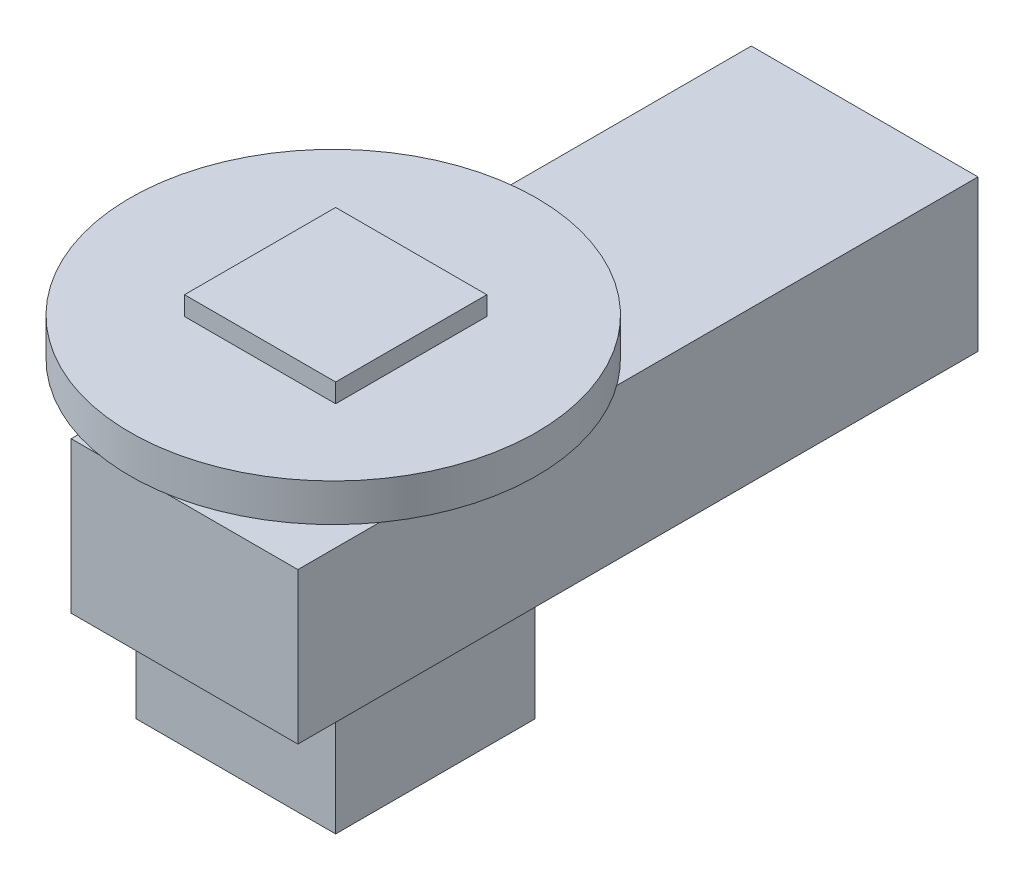
ISO-10303-21;
HEADER;
FILE_DESCRIPTION(('STEP AP214'),'2;1');
FILE_NAME('part.step','',(''),(''),'','','');
FILE_SCHEMA(('AUTOMOTIVE_DESIGN { 1 0 10303 214 1 1 1 1 }'));
ENDSEC;
DATA;
#1=APPLICATION_CONTEXT('core data for automotive mechanical design processes');
#2=APPLICATION_PROTOCOL_DEFINITION('international standard','automotive_design',2000,#1);
#3=PRODUCT_CONTEXT('',#1,'mechanical');
#4=PRODUCT('Part','Part','',(#3));
#5=PRODUCT_RELATED_PRODUCT_CATEGORY('part','',(#4));
#6=PRODUCT_DEFINITION_FORMATION('','',#4);
#7=PRODUCT_DEFINITION_CONTEXT('part definition',#1,'design');
#8=PRODUCT_DEFINITION('design','',#6,#7);
#9=PRODUCT_DEFINITION_SHAPE('','',#8);
#10=(LENGTH_UNIT() NAMED_UNIT(*) SI_UNIT(.MILLI.,.METRE.));
#11=(NAMED_UNIT(*) PLANE_ANGLE_UNIT() SI_UNIT($,.RADIAN.));
#12=(NAMED_UNIT(*) SI_UNIT($,.STERADIAN.) SOLID_ANGLE_UNIT());
#13=UNCERTAINTY_MEASURE_WITH_UNIT(LENGTH_MEASURE(1.E-05),#10,'distance_accuracy_value','');
#14=(GEOMETRIC_REPRESENTATION_CONTEXT(3) GLOBAL_UNCERTAINTY_ASSIGNED_CONTEXT((#13)) GLOBAL_UNIT_ASSIGNED_CONTEXT((#10,
#11,#12)) REPRESENTATION_CONTEXT('',''));
#15=CARTESIAN_POINT('',(0.,0.,0.));
#16=DIRECTION('',(0.,0.,1.));
#17=DIRECTION('',(1.,0.,0.));
#18=AXIS2_PLACEMENT_3D('',#15,#16,#17);
#19=CARTESIAN_POINT('',(0.,25.4,114.3));
#20=DIRECTION('',(0.,-1.,0.));
#21=DIRECTION('',(0.,0.,-1.));
#22=AXIS2_PLACEMENT_3D('',#19,#20,#21);
#23=PLANE('',#22);
#24=DIRECTION('',(-1.,0.,0.));
#25=VECTOR('',#24,1.);
#26=CARTESIAN_POINT('',(0.,25.4,0.));
#27=LINE('',#26,#25);
#28=CARTESIAN_POINT('',(0.,25.4,0.));
#29=VERTEX_POINT('',#28);
#30=CARTESIAN_POINT('',(-38.1,25.4,0.));
#31=VERTEX_POINT('',#30);
#32=EDGE_CURVE('E193',#29,#31,#27,.T.);
#33=ORIENTED_EDGE('',*,*,#32,.T.);
#34=DIRECTION('',(0.,0.,-1.));
#35=VECTOR('',#34,1.);
#36=CARTESIAN_POINT('',(-38.1,25.4,114.3));
#37=LINE('',#36,#35);
#38=CARTESIAN_POINT('',(-38.1,25.4,114.3));
#39=VERTEX_POINT('',#38);
#40=EDGE_CURVE('E203',#39,#31,#37,.T.);
#41=ORIENTED_EDGE('',*,*,#40,.F.);
#42=DIRECTION('',(-1.,0.,0.));
#43=VECTOR('',#42,1.);
#44=CARTESIAN_POINT('',(0.,25.4,114.3));
#45=LINE('',#44,#43);
#46=CARTESIAN_POINT('',(0.,25.4,114.3));
#47=VERTEX_POINT('',#46);
#48=EDGE_CURVE('E183',#47,#39,#45,.T.);
#49=ORIENTED_EDGE('',*,*,#48,.F.);
#50=DIRECTION('',(0.,0.,-1.));
#51=VECTOR('',#50,1.);
#52=CARTESIAN_POINT('',(0.,25.4,114.3));
#53=LINE('',#52,#51);
#54=EDGE_CURVE('E206',#47,#29,#53,.T.);
#55=ORIENTED_EDGE('',*,*,#54,.T.);
#56=EDGE_LOOP('',(#33,#41,#49,#55));
#57=FACE_BOUND('',#56,.T.);
#58=CARTESIAN_POINT('',(-19.05,25.4,88.9));
#59=DIRECTION('',(0.,-1.,0.));
#60=DIRECTION('',(0.,0.,-1.));
#61=AXIS2_PLACEMENT_3D('',#58,#59,#60);
#62=CIRCLE('',#61,6.35);
#63=CARTESIAN_POINT('',(-19.05,25.4,82.55));
#64=VERTEX_POINT('',#63);
#65=EDGE_CURVE('E41',#64,#64,#62,.F.);
#66=ORIENTED_EDGE('',*,*,#65,.F.);
#67=EDGE_LOOP('',(#66));
#68=FACE_BOUND('',#67,.T.);
#69=ADVANCED_FACE('F32',(#57,#68),#23,.F.);
#70=CARTESIAN_POINT('',(0.,0.,114.3));
#71=DIRECTION('',(0.,1.,0.));
#72=DIRECTION('',(-1.,0.,0.));
#73=AXIS2_PLACEMENT_3D('',#70,#71,#72);
#74=PLANE('',#73);
#75=DIRECTION('',(1.,0.,0.));
#76=VECTOR('',#75,1.);
#77=CARTESIAN_POINT('',(0.,0.,0.));
#78=LINE('',#77,#76);
#79=CARTESIAN_POINT('',(-38.1,0.,0.));
#80=VERTEX_POINT('',#79);
#81=CARTESIAN_POINT('',(0.,0.,0.));
#82=VERTEX_POINT('',#81);
#83=EDGE_CURVE('E184',#80,#82,#78,.T.);
#84=ORIENTED_EDGE('',*,*,#83,.T.);
#85=DIRECTION('',(0.,0.,-1.));
#86=VECTOR('',#85,1.);
#87=CARTESIAN_POINT('',(0.,0.,114.3));
#88=LINE('',#87,#86);
#89=CARTESIAN_POINT('',(0.,0.,114.3));
#90=VERTEX_POINT('',#89);
#91=EDGE_CURVE('E190',#90,#82,#88,.T.);
#92=ORIENTED_EDGE('',*,*,#91,.F.);
#93=DIRECTION('',(1.,0.,0.));
#94=VECTOR('',#93,1.);
#95=CARTESIAN_POINT('',(0.,0.,114.3));
#96=LINE('',#95,#94);
#97=CARTESIAN_POINT('',(-38.1,0.,114.3));
#98=VERTEX_POINT('',#97);
#99=EDGE_CURVE('E188',#98,#90,#96,.T.);
#100=ORIENTED_EDGE('',*,*,#99,.F.);
#101=DIRECTION('',(0.,0.,-1.));
#102=VECTOR('',#101,1.);
#103=CARTESIAN_POINT('',(-38.1,0.,114.3));
#104=LINE('',#103,#102);
#105=EDGE_CURVE('E200',#98,#80,#104,.T.);
#106=ORIENTED_EDGE('',*,*,#105,.T.);
#107=EDGE_LOOP('',(#84,#92,#100,#106));
#108=FACE_BOUND('',#107,.T.);
#109=DIRECTION('',(0.,0.,1.));
#110=VECTOR('',#109,1.);
#111=CARTESIAN_POINT('',(-2.28599999999999,0.,105.664));
#112=LINE('',#111,#110);
#113=CARTESIAN_POINT('',(-2.286,0.,72.136));
#114=VERTEX_POINT('',#113);
#115=CARTESIAN_POINT('',(-2.28599999999999,0.,105.664));
#116=VERTEX_POINT('',#115);
#117=EDGE_CURVE('E160',#114,#116,#112,.T.);
#118=ORIENTED_EDGE('',*,*,#117,.F.);
#119=DIRECTION('',(1.,0.,0.));
#120=VECTOR('',#119,1.);
#121=CARTESIAN_POINT('',(-2.286,0.,72.136));
#122=LINE('',#121,#120);
#123=CARTESIAN_POINT('',(-35.814,0.,72.136));
#124=VERTEX_POINT('',#123);
#125=EDGE_CURVE('E153',#124,#114,#122,.T.);
#126=ORIENTED_EDGE('',*,*,#125,.F.);
#127=DIRECTION('',(0.,0.,-1.));
#128=VECTOR('',#127,1.);
#129=CARTESIAN_POINT('',(-35.814,0.,105.664));
#130=LINE('',#129,#128);
#131=CARTESIAN_POINT('',(-35.814,0.,105.664));
#132=VERTEX_POINT('',#131);
#133=EDGE_CURVE('E164',#132,#124,#130,.T.);
#134=ORIENTED_EDGE('',*,*,#133,.F.);
#135=DIRECTION('',(-1.,0.,0.));
#136=VECTOR('',#135,1.);
#137=CARTESIAN_POINT('',(-2.28599999999999,0.,105.664));
#138=LINE('',#137,#136);
#139=EDGE_CURVE('E55',#116,#132,#138,.T.);
#140=ORIENTED_EDGE('',*,*,#139,.F.);
#141=EDGE_LOOP('',(#118,#126,#134,#140));
#142=FACE_BOUND('',#141,.T.);
#143=ADVANCED_FACE('F215',(#108,#142),#74,.F.);
#144=CARTESIAN_POINT('',(0.,0.,114.3));
#145=DIRECTION('',(-1.,0.,0.));
#146=DIRECTION('',(0.,0.,1.));
#147=AXIS2_PLACEMENT_3D('',#144,#145,#146);
#148=PLANE('',#147);
#149=DIRECTION('',(0.,1.,0.));
#150=VECTOR('',#149,1.);
#151=CARTESIAN_POINT('',(0.,0.,0.));
#152=LINE('',#151,#150);
#153=EDGE_CURVE('E179',#82,#29,#152,.T.);
#154=ORIENTED_EDGE('',*,*,#153,.T.);
#155=ORIENTED_EDGE('',*,*,#54,.F.);
#156=DIRECTION('',(0.,1.,0.));
#157=VECTOR('',#156,1.);
#158=CARTESIAN_POINT('',(0.,0.,114.3));
#159=LINE('',#158,#157);
#160=EDGE_CURVE('E180',#90,#47,#159,.T.);
#161=ORIENTED_EDGE('',*,*,#160,.F.);
#162=ORIENTED_EDGE('',*,*,#91,.T.);
#163=EDGE_LOOP('',(#154,#155,#161,#162));
#164=FACE_BOUND('',#163,.T.);
#165=ADVANCED_FACE('F34',(#164),#148,.F.);
#166=CARTESIAN_POINT('',(-38.1,0.,114.3));
#167=DIRECTION('',(1.,0.,0.));
#168=DIRECTION('',(0.,0.,-1.));
#169=AXIS2_PLACEMENT_3D('',#166,#167,#168);
#170=PLANE('',#169);
#171=DIRECTION('',(0.,-1.,0.));
#172=VECTOR('',#171,1.);
#173=CARTESIAN_POINT('',(-38.1,0.,0.));
#174=LINE('',#173,#172);
#175=EDGE_CURVE('E195',#31,#80,#174,.T.);
#176=ORIENTED_EDGE('',*,*,#175,.T.);
#177=ORIENTED_EDGE('',*,*,#105,.F.);
#178=DIRECTION('',(0.,-1.,0.));
#179=VECTOR('',#178,1.);
#180=CARTESIAN_POINT('',(-38.1,0.,114.3));
#181=LINE('',#180,#179);
#182=EDGE_CURVE('E186',#39,#98,#181,.T.);
#183=ORIENTED_EDGE('',*,*,#182,.F.);
#184=ORIENTED_EDGE('',*,*,#40,.T.);
#185=EDGE_LOOP('',(#176,#177,#183,#184));
#186=FACE_BOUND('',#185,.T.);
#187=ADVANCED_FACE('F223',(#186),#170,.F.);
#188=CARTESIAN_POINT('',(0.,0.,114.3));
#189=DIRECTION('',(0.,0.,1.));
#190=DIRECTION('',(1.,0.,0.));
#191=AXIS2_PLACEMENT_3D('',#188,#189,#190);
#192=PLANE('',#191);
#193=ORIENTED_EDGE('',*,*,#160,.T.);
#194=ORIENTED_EDGE('',*,*,#48,.T.);
#195=ORIENTED_EDGE('',*,*,#182,.T.);
#196=ORIENTED_EDGE('',*,*,#99,.T.);
#197=EDGE_LOOP('',(#193,#194,#195,#196));
#198=FACE_BOUND('',#197,.T.);
#199=ADVANCED_FACE('F225',(#198),#192,.T.);
#200=CARTESIAN_POINT('',(0.,0.,0.));
#201=DIRECTION('',(0.,0.,1.));
#202=DIRECTION('',(1.,0.,0.));
#203=AXIS2_PLACEMENT_3D('',#200,#201,#202);
#204=PLANE('',#203);
#205=ORIENTED_EDGE('',*,*,#153,.F.);
#206=ORIENTED_EDGE('',*,*,#83,.F.);
#207=ORIENTED_EDGE('',*,*,#175,.F.);
#208=ORIENTED_EDGE('',*,*,#32,.F.);
#209=EDGE_LOOP('',(#205,#206,#207,#208));
#210=FACE_BOUND('',#209,.T.);
#211=ADVANCED_FACE('F228',(#210),#204,.F.);
#212=CARTESIAN_POINT('',(-2.28599999999999,-18.542,105.664));
#213=DIRECTION('',(-1.,0.,0.));
#214=DIRECTION('',(0.,0.,1.));
#215=AXIS2_PLACEMENT_3D('',#212,#213,#214);
#216=PLANE('',#215);
#217=ORIENTED_EDGE('',*,*,#117,.T.);
#218=DIRECTION('',(0.,1.,0.));
#219=VECTOR('',#218,1.);
#220=CARTESIAN_POINT('',(-2.28599999999999,-18.542,105.664));
#221=LINE('',#220,#219);
#222=CARTESIAN_POINT('',(-2.28599999999999,-18.542,105.664));
#223=VERTEX_POINT('',#222);
#224=EDGE_CURVE('E177',#223,#116,#221,.T.);
#225=ORIENTED_EDGE('',*,*,#224,.F.);
#226=DIRECTION('',(0.,0.,1.));
#227=VECTOR('',#226,1.);
#228=CARTESIAN_POINT('',(-2.28599999999999,-18.542,105.664));
#229=LINE('',#228,#227);
#230=CARTESIAN_POINT('',(-2.286,-18.542,72.136));
#231=VERTEX_POINT('',#230);
#232=EDGE_CURVE('E149',#231,#223,#229,.T.);
#233=ORIENTED_EDGE('',*,*,#232,.F.);
#234=DIRECTION('',(0.,1.,0.));
#235=VECTOR('',#234,1.);
#236=CARTESIAN_POINT('',(-2.286,-18.542,72.136));
#237=LINE('',#236,#235);
#238=EDGE_CURVE('E159',#231,#114,#237,.T.);
#239=ORIENTED_EDGE('',*,*,#238,.T.);
#240=EDGE_LOOP('',(#217,#225,#233,#239));
#241=FACE_BOUND('',#240,.T.);
#242=ADVANCED_FACE('F231',(#241),#216,.F.);
#243=CARTESIAN_POINT('',(-2.28599999999999,-18.542,105.664));
#244=DIRECTION('',(0.,0.,-1.));
#245=DIRECTION('',(-1.,0.,0.));
#246=AXIS2_PLACEMENT_3D('',#243,#244,#245);
#247=PLANE('',#246);
#248=ORIENTED_EDGE('',*,*,#139,.T.);
#249=DIRECTION('',(0.,1.,0.));
#250=VECTOR('',#249,1.);
#251=CARTESIAN_POINT('',(-35.814,-18.542,105.664));
#252=LINE('',#251,#250);
#253=CARTESIAN_POINT('',(-35.814,-18.542,105.664));
#254=VERTEX_POINT('',#253);
#255=EDGE_CURVE('E174',#254,#132,#252,.T.);
#256=ORIENTED_EDGE('',*,*,#255,.F.);
#257=DIRECTION('',(-1.,0.,0.));
#258=VECTOR('',#257,1.);
#259=CARTESIAN_POINT('',(-2.28599999999999,-18.542,105.664));
#260=LINE('',#259,#258);
#261=EDGE_CURVE('E152',#223,#254,#260,.T.);
#262=ORIENTED_EDGE('',*,*,#261,.F.);
#263=ORIENTED_EDGE('',*,*,#224,.T.);
#264=EDGE_LOOP('',(#248,#256,#262,#263));
#265=FACE_BOUND('',#264,.T.);
#266=ADVANCED_FACE('F238',(#265),#247,.F.);
#267=CARTESIAN_POINT('',(-35.814,-18.542,105.664));
#268=DIRECTION('',(1.,0.,0.));
#269=DIRECTION('',(0.,0.,-1.));
#270=AXIS2_PLACEMENT_3D('',#267,#268,#269);
#271=PLANE('',#270);
#272=ORIENTED_EDGE('',*,*,#133,.T.);
#273=DIRECTION('',(0.,1.,0.));
#274=VECTOR('',#273,1.);
#275=CARTESIAN_POINT('',(-35.814,-18.542,72.136));
#276=LINE('',#275,#274);
#277=CARTESIAN_POINT('',(-35.814,-18.542,72.136));
#278=VERTEX_POINT('',#277);
#279=EDGE_CURVE('E171',#278,#124,#276,.T.);
#280=ORIENTED_EDGE('',*,*,#279,.F.);
#281=DIRECTION('',(0.,0.,-1.));
#282=VECTOR('',#281,1.);
#283=CARTESIAN_POINT('',(-35.814,-18.542,105.664));
#284=LINE('',#283,#282);
#285=EDGE_CURVE('E155',#254,#278,#284,.T.);
#286=ORIENTED_EDGE('',*,*,#285,.F.);
#287=ORIENTED_EDGE('',*,*,#255,.T.);
#288=EDGE_LOOP('',(#272,#280,#286,#287));
#289=FACE_BOUND('',#288,.T.);
#290=ADVANCED_FACE('F242',(#289),#271,.F.);
#291=CARTESIAN_POINT('',(-2.286,-18.542,72.136));
#292=DIRECTION('',(0.,0.,1.));
#293=DIRECTION('',(1.,0.,0.));
#294=AXIS2_PLACEMENT_3D('',#291,#292,#293);
#295=PLANE('',#294);
#296=ORIENTED_EDGE('',*,*,#125,.T.);
#297=ORIENTED_EDGE('',*,*,#238,.F.);
#298=DIRECTION('',(1.,0.,0.));
#299=VECTOR('',#298,1.);
#300=CARTESIAN_POINT('',(-2.286,-18.542,72.136));
#301=LINE('',#300,#299);
#302=EDGE_CURVE('E157',#278,#231,#301,.T.);
#303=ORIENTED_EDGE('',*,*,#302,.F.);
#304=ORIENTED_EDGE('',*,*,#279,.T.);
#305=EDGE_LOOP('',(#296,#297,#303,#304));
#306=FACE_BOUND('',#305,.T.);
#307=ADVANCED_FACE('F246',(#306),#295,.F.);
#308=CARTESIAN_POINT('',(0.,-18.542,0.));
#309=DIRECTION('',(0.,1.,0.));
#310=DIRECTION('',(-1.,0.,0.));
#311=AXIS2_PLACEMENT_3D('',#308,#309,#310);
#312=PLANE('',#311);
#313=ORIENTED_EDGE('',*,*,#232,.T.);
#314=ORIENTED_EDGE('',*,*,#261,.T.);
#315=ORIENTED_EDGE('',*,*,#285,.T.);
#316=ORIENTED_EDGE('',*,*,#302,.T.);
#317=EDGE_LOOP('',(#313,#314,#315,#316));
#318=FACE_BOUND('',#317,.T.);
#319=ADVANCED_FACE('F250',(#318),#312,.F.);
#320=CARTESIAN_POINT('',(-19.05,43.18,88.9));
#321=DIRECTION('',(0.,-1.,0.));
#322=DIRECTION('',(0.,0.,-1.));
#323=AXIS2_PLACEMENT_3D('',#320,#321,#322);
#324=CYLINDRICAL_SURFACE('',#323,6.35);
#325=CARTESIAN_POINT('',(-19.05,33.655,88.9));
#326=DIRECTION('',(0.,-1.,0.));
#327=DIRECTION('',(0.,0.,-1.));
#328=AXIS2_PLACEMENT_3D('',#325,#326,#327);
#329=CIRCLE('',#328,6.35);
#330=CARTESIAN_POINT('',(-19.05,33.655,82.55));
#331=VERTEX_POINT('',#330);
#332=EDGE_CURVE('E36',#331,#331,#329,.T.);
#333=ORIENTED_EDGE('',*,*,#332,.T.);
#334=EDGE_LOOP('',(#333));
#335=FACE_BOUND('',#334,.T.);
#336=ORIENTED_EDGE('',*,*,#65,.T.);
#337=EDGE_LOOP('',(#336));
#338=FACE_BOUND('',#337,.T.);
#339=ADVANCED_FACE('F212',(#335,#338),#324,.T.);
#340=CARTESIAN_POINT('',(-19.4506927058455,33.655,88.9));
#341=DIRECTION('',(0.,-1.,0.));
#342=DIRECTION('',(0.,0.,-1.));
#343=AXIS2_PLACEMENT_3D('',#340,#341,#342);
#344=PLANE('',#343);
#345=CARTESIAN_POINT('',(-19.4506927058455,33.655,88.9));
#346=DIRECTION('',(0.,-1.,0.));
#347=DIRECTION('',(0.,0.,-1.));
#348=AXIS2_PLACEMENT_3D('',#345,#346,#347);
#349=CIRCLE('',#348,34.1376);
#350=CARTESIAN_POINT('',(-19.4506927058455,33.655,54.7624));
#351=VERTEX_POINT('',#350);
#352=EDGE_CURVE('E288',#351,#351,#349,.T.);
#353=ORIENTED_EDGE('',*,*,#352,.T.);
#354=EDGE_LOOP('',(#353));
#355=FACE_BOUND('',#354,.T.);
#356=ORIENTED_EDGE('',*,*,#332,.F.);
#357=EDGE_LOOP('',(#356));
#358=FACE_BOUND('',#357,.T.);
#359=ADVANCED_FACE('F257',(#355,#358),#344,.T.);
#360=CARTESIAN_POINT('',(-19.4506927058455,33.655,88.9));
#361=DIRECTION('',(0.,1.,0.));
#362=DIRECTION('',(0.,0.,1.));
#363=AXIS2_PLACEMENT_3D('',#360,#361,#362);
#364=CYLINDRICAL_SURFACE('',#363,34.1376);
#365=ORIENTED_EDGE('',*,*,#352,.F.);
#366=EDGE_LOOP('',(#365));
#367=FACE_BOUND('',#366,.T.);
#368=CARTESIAN_POINT('',(-19.4506927058455,40.005,88.9));
#369=DIRECTION('',(0.,-1.,0.));
#370=DIRECTION('',(0.,0.,-1.));
#371=AXIS2_PLACEMENT_3D('',#368,#369,#370);
#372=CIRCLE('',#371,34.1376);
#373=CARTESIAN_POINT('',(-19.4506927058455,40.005,54.7624));
#374=VERTEX_POINT('',#373);
#375=EDGE_CURVE('E303',#374,#374,#372,.T.);
#376=ORIENTED_EDGE('',*,*,#375,.T.);
#377=EDGE_LOOP('',(#376));
#378=FACE_BOUND('',#377,.T.);
#379=ADVANCED_FACE('F275',(#367,#378),#364,.T.);
#380=CARTESIAN_POINT('',(-19.4506927058455,40.005,88.9));
#381=DIRECTION('',(0.,-1.,0.));
#382=DIRECTION('',(0.,0.,-1.));
#383=AXIS2_PLACEMENT_3D('',#380,#381,#382);
#384=PLANE('',#383);
#385=DIRECTION('',(0.,0.,-1.));
#386=VECTOR('',#385,1.);
#387=CARTESIAN_POINT('',(-6.34999999999999,40.005,101.6));
#388=LINE('',#387,#386);
#389=CARTESIAN_POINT('',(-6.34999999999999,40.005,101.6));
#390=VERTEX_POINT('',#389);
#391=CARTESIAN_POINT('',(-6.34999999999999,40.005,76.2));
#392=VERTEX_POINT('',#391);
#393=EDGE_CURVE('E121',#390,#392,#388,.T.);
#394=ORIENTED_EDGE('',*,*,#393,.F.);
#395=DIRECTION('',(1.,0.,0.));
#396=VECTOR('',#395,1.);
#397=CARTESIAN_POINT('',(-31.75,40.005,101.6));
#398=LINE('',#397,#396);
#399=CARTESIAN_POINT('',(-31.75,40.005,101.6));
#400=VERTEX_POINT('',#399);
#401=EDGE_CURVE('E133',#400,#390,#398,.T.);
#402=ORIENTED_EDGE('',*,*,#401,.F.);
#403=DIRECTION('',(0.,0.,1.));
#404=VECTOR('',#403,1.);
#405=CARTESIAN_POINT('',(-31.75,40.005,101.6));
#406=LINE('',#405,#404);
#407=CARTESIAN_POINT('',(-31.75,40.005,76.2));
#408=VERTEX_POINT('',#407);
#409=EDGE_CURVE('E48',#408,#400,#406,.T.);
#410=ORIENTED_EDGE('',*,*,#409,.F.);
#411=DIRECTION('',(-1.,0.,0.));
#412=VECTOR('',#411,1.);
#413=CARTESIAN_POINT('',(-31.75,40.005,76.2));
#414=LINE('',#413,#412);
#415=EDGE_CURVE('E11',#392,#408,#414,.T.);
#416=ORIENTED_EDGE('',*,*,#415,.F.);
#417=EDGE_LOOP('',(#394,#402,#410,#416));
#418=FACE_BOUND('',#417,.T.);
#419=ORIENTED_EDGE('',*,*,#375,.F.);
#420=EDGE_LOOP('',(#419));
#421=FACE_BOUND('',#420,.T.);
#422=ADVANCED_FACE('F119',(#418,#421),#384,.F.);
#423=CARTESIAN_POINT('',(-19.05,43.18,88.9));
#424=DIRECTION('',(0.,1.,0.));
#425=DIRECTION('',(0.,0.,1.));
#426=AXIS2_PLACEMENT_3D('',#423,#424,#425);
#427=PLANE('',#426);
#428=DIRECTION('',(0.,0.,-1.));
#429=VECTOR('',#428,1.);
#430=CARTESIAN_POINT('',(-6.34999999999999,43.18,101.6));
#431=LINE('',#430,#429);
#432=CARTESIAN_POINT('',(-6.34999999999999,43.18,101.6));
#433=VERTEX_POINT('',#432);
#434=CARTESIAN_POINT('',(-6.34999999999999,43.18,76.2));
#435=VERTEX_POINT('',#434);
#436=EDGE_CURVE('E291',#433,#435,#431,.T.);
#437=ORIENTED_EDGE('',*,*,#436,.T.);
#438=DIRECTION('',(-1.,0.,0.));
#439=VECTOR('',#438,1.);
#440=CARTESIAN_POINT('',(-31.75,43.18,76.2));
#441=LINE('',#440,#439);
#442=CARTESIAN_POINT('',(-31.75,43.18,76.2));
#443=VERTEX_POINT('',#442);
#444=EDGE_CURVE('E137',#435,#443,#441,.T.);
#445=ORIENTED_EDGE('',*,*,#444,.T.);
#446=DIRECTION('',(0.,0.,1.));
#447=VECTOR('',#446,1.);
#448=CARTESIAN_POINT('',(-31.75,43.18,101.6));
#449=LINE('',#448,#447);
#450=CARTESIAN_POINT('',(-31.75,43.18,101.6));
#451=VERTEX_POINT('',#450);
#452=EDGE_CURVE('E145',#443,#451,#449,.T.);
#453=ORIENTED_EDGE('',*,*,#452,.T.);
#454=DIRECTION('',(1.,0.,0.));
#455=VECTOR('',#454,1.);
#456=CARTESIAN_POINT('',(-31.75,43.18,101.6));
#457=LINE('',#456,#455);
#458=EDGE_CURVE('E140',#451,#433,#457,.T.);
#459=ORIENTED_EDGE('',*,*,#458,.T.);
#460=EDGE_LOOP('',(#437,#445,#453,#459));
#461=FACE_BOUND('',#460,.T.);
#462=ADVANCED_FACE('F259',(#461),#427,.T.);
#463=CARTESIAN_POINT('',(-31.75,36.83,76.2));
#464=DIRECTION('',(0.,0.,-1.));
#465=DIRECTION('',(-1.,0.,0.));
#466=AXIS2_PLACEMENT_3D('',#463,#464,#465);
#467=PLANE('',#466);
#468=DIRECTION('',(0.,1.,0.));
#469=VECTOR('',#468,1.);
#470=CARTESIAN_POINT('',(-6.34999999999999,36.83,76.2));
#471=LINE('',#470,#469);
#472=EDGE_CURVE('E130',#392,#435,#471,.T.);
#473=ORIENTED_EDGE('',*,*,#472,.F.);
#474=ORIENTED_EDGE('',*,*,#415,.T.);
#475=DIRECTION('',(0.,1.,0.));
#476=VECTOR('',#475,1.);
#477=CARTESIAN_POINT('',(-31.75,36.83,76.2));
#478=LINE('',#477,#476);
#479=EDGE_CURVE('E139',#408,#443,#478,.T.);
#480=ORIENTED_EDGE('',*,*,#479,.T.);
#481=ORIENTED_EDGE('',*,*,#444,.F.);
#482=EDGE_LOOP('',(#473,#474,#480,#481));
#483=FACE_BOUND('',#482,.T.);
#484=ADVANCED_FACE('F135',(#483),#467,.T.);
#485=CARTESIAN_POINT('',(-31.75,36.83,101.6));
#486=DIRECTION('',(-1.,0.,0.));
#487=DIRECTION('',(0.,0.,1.));
#488=AXIS2_PLACEMENT_3D('',#485,#486,#487);
#489=PLANE('',#488);
#490=ORIENTED_EDGE('',*,*,#479,.F.);
#491=ORIENTED_EDGE('',*,*,#409,.T.);
#492=DIRECTION('',(0.,1.,0.));
#493=VECTOR('',#492,1.);
#494=CARTESIAN_POINT('',(-31.75,36.83,101.6));
#495=LINE('',#494,#493);
#496=EDGE_CURVE('E142',#400,#451,#495,.T.);
#497=ORIENTED_EDGE('',*,*,#496,.T.);
#498=ORIENTED_EDGE('',*,*,#452,.F.);
#499=EDGE_LOOP('',(#490,#491,#497,#498));
#500=FACE_BOUND('',#499,.T.);
#501=ADVANCED_FACE('F268',(#500),#489,.T.);
#502=CARTESIAN_POINT('',(-31.75,36.83,101.6));
#503=DIRECTION('',(0.,0.,1.));
#504=DIRECTION('',(1.,0.,0.));
#505=AXIS2_PLACEMENT_3D('',#502,#503,#504);
#506=PLANE('',#505);
#507=ORIENTED_EDGE('',*,*,#496,.F.);
#508=ORIENTED_EDGE('',*,*,#401,.T.);
#509=DIRECTION('',(0.,1.,0.));
#510=VECTOR('',#509,1.);
#511=CARTESIAN_POINT('',(-6.34999999999999,36.83,101.6));
#512=LINE('',#511,#510);
#513=EDGE_CURVE('E132',#390,#433,#512,.T.);
#514=ORIENTED_EDGE('',*,*,#513,.T.);
#515=ORIENTED_EDGE('',*,*,#458,.F.);
#516=EDGE_LOOP('',(#507,#508,#514,#515));
#517=FACE_BOUND('',#516,.T.);
#518=ADVANCED_FACE('F265',(#517),#506,.T.);
#519=CARTESIAN_POINT('',(-6.34999999999999,36.83,101.6));
#520=DIRECTION('',(1.,0.,0.));
#521=DIRECTION('',(0.,0.,-1.));
#522=AXIS2_PLACEMENT_3D('',#519,#520,#521);
#523=PLANE('',#522);
#524=ORIENTED_EDGE('',*,*,#513,.F.);
#525=ORIENTED_EDGE('',*,*,#393,.T.);
#526=ORIENTED_EDGE('',*,*,#472,.T.);
#527=ORIENTED_EDGE('',*,*,#436,.F.);
#528=EDGE_LOOP('',(#524,#525,#526,#527));
#529=FACE_BOUND('',#528,.T.);
#530=ADVANCED_FACE('F128',(#529),#523,.T.);
#531=CLOSED_SHELL('',(#69,#143,#165,#187,#199,#211,#242,#266,#290,#307,#319,#339,#359,#379,#422,
#462,#484,#501,#518,#530));
#532=MANIFOLD_SOLID_BREP('B2',#531);
#533=ADVANCED_BREP_SHAPE_REPRESENTATION('',(#18,#532),#14);
#534=SHAPE_DEFINITION_REPRESENTATION(#9,#533);
ENDSEC;
END-ISO-10303-21;
